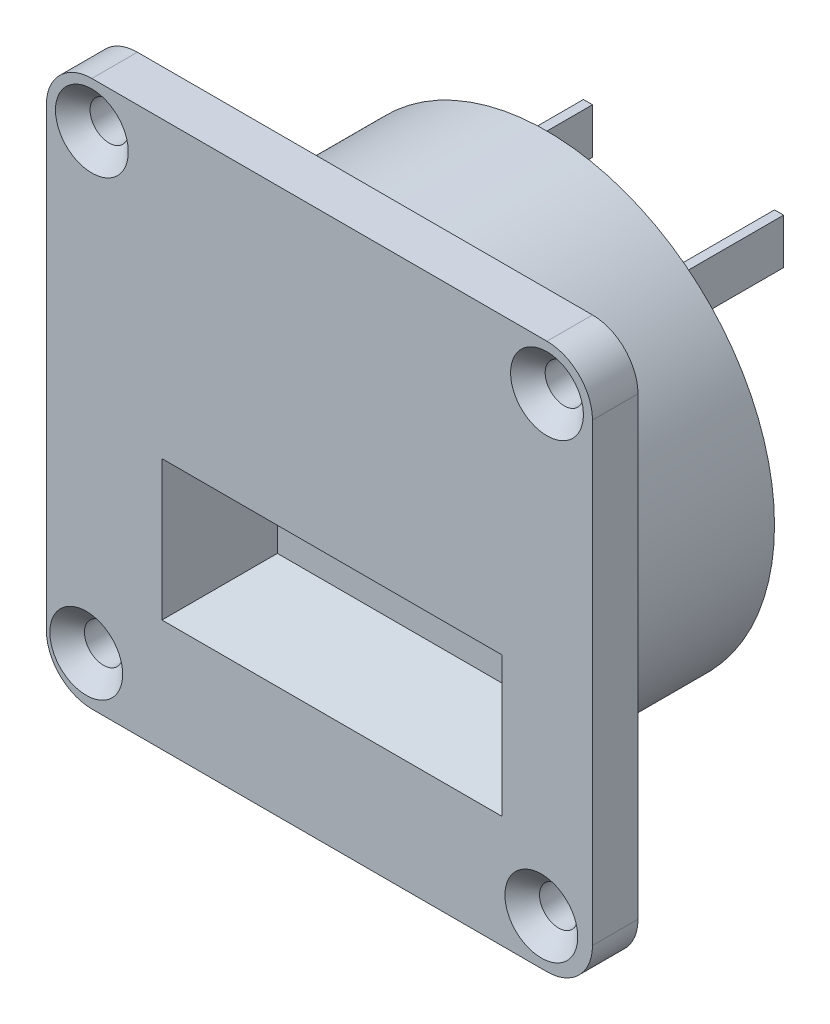
ISO-10303-21;
HEADER;
FILE_DESCRIPTION(('STEP AP214'),'2;1');
FILE_NAME('part.step','',(''),(''),'','','');
FILE_SCHEMA(('AUTOMOTIVE_DESIGN { 1 0 10303 214 1 1 1 1 }'));
ENDSEC;
DATA;
#1=APPLICATION_CONTEXT('core data for automotive mechanical design processes');
#2=APPLICATION_PROTOCOL_DEFINITION('international standard','automotive_design',2000,#1);
#3=PRODUCT_CONTEXT('',#1,'mechanical');
#4=PRODUCT('Part','Part','',(#3));
#5=PRODUCT_RELATED_PRODUCT_CATEGORY('part','',(#4));
#6=PRODUCT_DEFINITION_FORMATION('','',#4);
#7=PRODUCT_DEFINITION_CONTEXT('part definition',#1,'design');
#8=PRODUCT_DEFINITION('design','',#6,#7);
#9=PRODUCT_DEFINITION_SHAPE('','',#8);
#10=(LENGTH_UNIT() NAMED_UNIT(*) SI_UNIT(.MILLI.,.METRE.));
#11=(NAMED_UNIT(*) PLANE_ANGLE_UNIT() SI_UNIT($,.RADIAN.));
#12=(NAMED_UNIT(*) SI_UNIT($,.STERADIAN.) SOLID_ANGLE_UNIT());
#13=UNCERTAINTY_MEASURE_WITH_UNIT(LENGTH_MEASURE(1.E-05),#10,'distance_accuracy_value','');
#14=(GEOMETRIC_REPRESENTATION_CONTEXT(3) GLOBAL_UNCERTAINTY_ASSIGNED_CONTEXT((#13)) GLOBAL_UNIT_ASSIGNED_CONTEXT((#10,
#11,#12)) REPRESENTATION_CONTEXT('',''));
#15=CARTESIAN_POINT('',(0.,0.,0.));
#16=DIRECTION('',(0.,0.,1.));
#17=DIRECTION('',(1.,0.,0.));
#18=AXIS2_PLACEMENT_3D('',#15,#16,#17);
#19=CARTESIAN_POINT('',(0.,60.,5.));
#20=DIRECTION('',(0.,0.,-1.));
#21=DIRECTION('',(-1.,0.,0.));
#22=AXIS2_PLACEMENT_3D('',#19,#20,#21);
#23=PLANE('',#22);
#24=CARTESIAN_POINT('',(54.382493283612,5.,5.));
#25=DIRECTION('',(0.,0.,-1.));
#26=DIRECTION('',(-1.,0.,0.));
#27=AXIS2_PLACEMENT_3D('',#24,#25,#26);
#28=CIRCLE('',#27,4.);
#29=CARTESIAN_POINT('',(50.382493283612,5.,5.));
#30=VERTEX_POINT('',#29);
#31=EDGE_CURVE('E340',#30,#30,#28,.T.);
#32=ORIENTED_EDGE('',*,*,#31,.T.);
#33=EDGE_LOOP('',(#32));
#34=FACE_BOUND('',#33,.T.);
#35=CARTESIAN_POINT('',(4.38249328361201,5.,5.));
#36=DIRECTION('',(0.,0.,-1.));
#37=DIRECTION('',(-1.,0.,0.));
#38=AXIS2_PLACEMENT_3D('',#35,#36,#37);
#39=CIRCLE('',#38,4.);
#40=CARTESIAN_POINT('',(0.382493283612007,5.,5.));
#41=VERTEX_POINT('',#40);
#42=EDGE_CURVE('E337',#41,#41,#39,.T.);
#43=ORIENTED_EDGE('',*,*,#42,.T.);
#44=EDGE_LOOP('',(#43));
#45=FACE_BOUND('',#44,.T.);
#46=CARTESIAN_POINT('',(5.,55.,5.));
#47=DIRECTION('',(0.,0.,-1.));
#48=DIRECTION('',(-1.,0.,0.));
#49=AXIS2_PLACEMENT_3D('',#46,#47,#48);
#50=CIRCLE('',#49,4.);
#51=CARTESIAN_POINT('',(1.,55.,5.));
#52=VERTEX_POINT('',#51);
#53=EDGE_CURVE('E334',#52,#52,#50,.T.);
#54=ORIENTED_EDGE('',*,*,#53,.T.);
#55=EDGE_LOOP('',(#54));
#56=FACE_BOUND('',#55,.T.);
#57=CARTESIAN_POINT('',(55.,55.,5.));
#58=DIRECTION('',(0.,0.,-1.));
#59=DIRECTION('',(-1.,0.,0.));
#60=AXIS2_PLACEMENT_3D('',#57,#58,#59);
#61=CIRCLE('',#60,4.);
#62=CARTESIAN_POINT('',(51.,55.,5.));
#63=VERTEX_POINT('',#62);
#64=EDGE_CURVE('E331',#63,#63,#61,.T.);
#65=ORIENTED_EDGE('',*,*,#64,.T.);
#66=EDGE_LOOP('',(#65));
#67=FACE_BOUND('',#66,.T.);
#68=DIRECTION('',(-1.,0.,0.));
#69=VECTOR('',#68,1.);
#70=CARTESIAN_POINT('',(15.3784033040619,12.3205080756888,5.));
#71=LINE('',#70,#69);
#72=CARTESIAN_POINT('',(12.6989113797507,12.3205080756888,5.));
#73=VERTEX_POINT('',#72);
#74=CARTESIAN_POINT('',(50.0578952283731,12.3205080756888,5.));
#75=VERTEX_POINT('',#74);
#76=EDGE_CURVE('E295',#73,#75,#71,.F.);
#77=ORIENTED_EDGE('',*,*,#76,.F.);
#78=DIRECTION('',(0.,1.,0.));
#79=VECTOR('',#78,1.);
#80=CARTESIAN_POINT('',(12.6989113797507,15.,5.));
#81=LINE('',#80,#79);
#82=CARTESIAN_POINT('',(12.6989113797507,27.6794919243112,5.));
#83=VERTEX_POINT('',#82);
#84=EDGE_CURVE('E174',#83,#73,#81,.F.);
#85=ORIENTED_EDGE('',*,*,#84,.F.);
#86=DIRECTION('',(1.,0.,0.));
#87=VECTOR('',#86,1.);
#88=CARTESIAN_POINT('',(15.3784033040619,27.6794919243112,5.));
#89=LINE('',#88,#87);
#90=CARTESIAN_POINT('',(50.0578952283731,27.6794919243112,5.));
#91=VERTEX_POINT('',#90);
#92=EDGE_CURVE('E191',#91,#83,#89,.F.);
#93=ORIENTED_EDGE('',*,*,#92,.F.);
#94=DIRECTION('',(0.,-1.,0.));
#95=VECTOR('',#94,1.);
#96=CARTESIAN_POINT('',(50.0578952283731,15.,5.));
#97=LINE('',#96,#95);
#98=EDGE_CURVE('E194',#75,#91,#97,.F.);
#99=ORIENTED_EDGE('',*,*,#98,.F.);
#100=EDGE_LOOP('',(#77,#85,#93,#99));
#101=FACE_BOUND('',#100,.T.);
#102=DIRECTION('',(0.,-1.,0.));
#103=VECTOR('',#102,1.);
#104=CARTESIAN_POINT('',(0.,0.,5.));
#105=LINE('',#104,#103);
#106=CARTESIAN_POINT('',(0.,55.,5.));
#107=VERTEX_POINT('',#106);
#108=CARTESIAN_POINT('',(0.,5.,5.));
#109=VERTEX_POINT('',#108);
#110=EDGE_CURVE('E278',#107,#109,#105,.T.);
#111=ORIENTED_EDGE('',*,*,#110,.T.);
#112=CARTESIAN_POINT('',(5.,5.,5.));
#113=DIRECTION('',(0.,0.,-1.));
#114=DIRECTION('',(-1.,0.,0.));
#115=AXIS2_PLACEMENT_3D('',#112,#113,#114);
#116=CIRCLE('',#115,5.);
#117=CARTESIAN_POINT('',(5.,0.,5.));
#118=VERTEX_POINT('',#117);
#119=EDGE_CURVE('E320',#109,#118,#116,.F.);
#120=ORIENTED_EDGE('',*,*,#119,.T.);
#121=DIRECTION('',(1.,0.,0.));
#122=VECTOR('',#121,1.);
#123=CARTESIAN_POINT('',(0.,0.,5.));
#124=LINE('',#123,#122);
#125=CARTESIAN_POINT('',(55.,0.,5.));
#126=VERTEX_POINT('',#125);
#127=EDGE_CURVE('E281',#118,#126,#124,.T.);
#128=ORIENTED_EDGE('',*,*,#127,.T.);
#129=CARTESIAN_POINT('',(55.,5.,5.));
#130=DIRECTION('',(0.,0.,-1.));
#131=DIRECTION('',(-1.,0.,0.));
#132=AXIS2_PLACEMENT_3D('',#129,#130,#131);
#133=CIRCLE('',#132,5.);
#134=CARTESIAN_POINT('',(60.,5.,5.));
#135=VERTEX_POINT('',#134);
#136=EDGE_CURVE('E318',#126,#135,#133,.F.);
#137=ORIENTED_EDGE('',*,*,#136,.T.);
#138=DIRECTION('',(0.,1.,0.));
#139=VECTOR('',#138,1.);
#140=CARTESIAN_POINT('',(60.,0.,5.));
#141=LINE('',#140,#139);
#142=CARTESIAN_POINT('',(60.,55.,5.));
#143=VERTEX_POINT('',#142);
#144=EDGE_CURVE('E284',#135,#143,#141,.T.);
#145=ORIENTED_EDGE('',*,*,#144,.T.);
#146=CARTESIAN_POINT('',(55.,55.,5.));
#147=DIRECTION('',(0.,0.,-1.));
#148=DIRECTION('',(-1.,0.,0.));
#149=AXIS2_PLACEMENT_3D('',#146,#147,#148);
#150=CIRCLE('',#149,5.);
#151=CARTESIAN_POINT('',(55.,60.,5.));
#152=VERTEX_POINT('',#151);
#153=EDGE_CURVE('E51',#143,#152,#150,.F.);
#154=ORIENTED_EDGE('',*,*,#153,.T.);
#155=DIRECTION('',(-1.,0.,0.));
#156=VECTOR('',#155,1.);
#157=CARTESIAN_POINT('',(0.,60.,5.));
#158=LINE('',#157,#156);
#159=CARTESIAN_POINT('',(5.,60.,5.));
#160=VERTEX_POINT('',#159);
#161=EDGE_CURVE('E286',#152,#160,#158,.T.);
#162=ORIENTED_EDGE('',*,*,#161,.T.);
#163=CARTESIAN_POINT('',(5.,55.,5.));
#164=DIRECTION('',(0.,0.,-1.));
#165=DIRECTION('',(-1.,0.,0.));
#166=AXIS2_PLACEMENT_3D('',#163,#164,#165);
#167=CIRCLE('',#166,5.);
#168=EDGE_CURVE('E316',#160,#107,#167,.F.);
#169=ORIENTED_EDGE('',*,*,#168,.T.);
#170=EDGE_LOOP('',(#111,#120,#128,#137,#145,#154,#162,#169));
#171=FACE_BOUND('',#170,.T.);
#172=ADVANCED_FACE('F29',(#34,#45,#56,#67,#101,#171),#23,.F.);
#173=CARTESIAN_POINT('',(30.,30.,-20.));
#174=DIRECTION('',(0.,0.,-1.));
#175=DIRECTION('',(-1.,0.,0.));
#176=AXIS2_PLACEMENT_3D('',#173,#174,#175);
#177=PLANE('',#176);
#178=DIRECTION('',(-1.,0.,0.));
#179=VECTOR('',#178,1.);
#180=CARTESIAN_POINT('',(41.,40.,-20.));
#181=LINE('',#180,#179);
#182=CARTESIAN_POINT('',(41.,40.,-20.));
#183=VERTEX_POINT('',#182);
#184=CARTESIAN_POINT('',(40.,40.,-20.));
#185=VERTEX_POINT('',#184);
#186=EDGE_CURVE('E235',#183,#185,#181,.T.);
#187=ORIENTED_EDGE('',*,*,#186,.F.);
#188=DIRECTION('',(0.,-1.,0.));
#189=VECTOR('',#188,1.);
#190=CARTESIAN_POINT('',(41.,40.,-20.));
#191=LINE('',#190,#189);
#192=CARTESIAN_POINT('',(41.,45.,-20.));
#193=VERTEX_POINT('',#192);
#194=EDGE_CURVE('E232',#193,#183,#191,.T.);
#195=ORIENTED_EDGE('',*,*,#194,.F.);
#196=DIRECTION('',(1.,0.,0.));
#197=VECTOR('',#196,1.);
#198=CARTESIAN_POINT('',(41.,45.,-20.));
#199=LINE('',#198,#197);
#200=CARTESIAN_POINT('',(40.,45.,-20.));
#201=VERTEX_POINT('',#200);
#202=EDGE_CURVE('E240',#201,#193,#199,.T.);
#203=ORIENTED_EDGE('',*,*,#202,.F.);
#204=DIRECTION('',(0.,1.,0.));
#205=VECTOR('',#204,1.);
#206=CARTESIAN_POINT('',(40.,40.,-20.));
#207=LINE('',#206,#205);
#208=EDGE_CURVE('E237',#185,#201,#207,.T.);
#209=ORIENTED_EDGE('',*,*,#208,.F.);
#210=EDGE_LOOP('',(#187,#195,#203,#209));
#211=FACE_BOUND('',#210,.T.);
#212=CARTESIAN_POINT('',(30.,30.,-20.));
#213=DIRECTION('',(0.,0.,-1.));
#214=DIRECTION('',(-1.,0.,0.));
#215=AXIS2_PLACEMENT_3D('',#212,#213,#214);
#216=CIRCLE('',#215,25.);
#217=CARTESIAN_POINT('',(5.,30.,-20.));
#218=VERTEX_POINT('',#217);
#219=EDGE_CURVE('E264',#218,#218,#216,.T.);
#220=ORIENTED_EDGE('',*,*,#219,.T.);
#221=EDGE_LOOP('',(#220));
#222=FACE_BOUND('',#221,.T.);
#223=DIRECTION('',(-1.,0.,0.));
#224=VECTOR('',#223,1.);
#225=CARTESIAN_POINT('',(20.,40.,-20.));
#226=LINE('',#225,#224);
#227=CARTESIAN_POINT('',(20.,40.,-20.));
#228=VERTEX_POINT('',#227);
#229=CARTESIAN_POINT('',(19.,40.,-20.));
#230=VERTEX_POINT('',#229);
#231=EDGE_CURVE('E205',#228,#230,#226,.T.);
#232=ORIENTED_EDGE('',*,*,#231,.F.);
#233=DIRECTION('',(0.,-1.,0.));
#234=VECTOR('',#233,1.);
#235=CARTESIAN_POINT('',(20.,45.,-20.));
#236=LINE('',#235,#234);
#237=CARTESIAN_POINT('',(20.,45.,-20.));
#238=VERTEX_POINT('',#237);
#239=EDGE_CURVE('E202',#238,#228,#236,.T.);
#240=ORIENTED_EDGE('',*,*,#239,.F.);
#241=DIRECTION('',(1.,0.,0.));
#242=VECTOR('',#241,1.);
#243=CARTESIAN_POINT('',(20.,45.,-20.));
#244=LINE('',#243,#242);
#245=CARTESIAN_POINT('',(19.,45.,-20.));
#246=VERTEX_POINT('',#245);
#247=EDGE_CURVE('E211',#246,#238,#244,.T.);
#248=ORIENTED_EDGE('',*,*,#247,.F.);
#249=DIRECTION('',(0.,1.,0.));
#250=VECTOR('',#249,1.);
#251=CARTESIAN_POINT('',(19.,45.,-20.));
#252=LINE('',#251,#250);
#253=EDGE_CURVE('E208',#230,#246,#252,.T.);
#254=ORIENTED_EDGE('',*,*,#253,.F.);
#255=EDGE_LOOP('',(#232,#240,#248,#254));
#256=FACE_BOUND('',#255,.T.);
#257=ADVANCED_FACE('F364',(#211,#222,#256),#177,.T.);
#258=CARTESIAN_POINT('',(0.,60.,0.));
#259=DIRECTION('',(0.,0.,-1.));
#260=DIRECTION('',(-1.,0.,0.));
#261=AXIS2_PLACEMENT_3D('',#258,#259,#260);
#262=PLANE('',#261);
#263=CARTESIAN_POINT('',(4.38249328361201,5.,0.));
#264=DIRECTION('',(0.,0.,1.));
#265=DIRECTION('',(1.,0.,0.));
#266=AXIS2_PLACEMENT_3D('',#263,#264,#265);
#267=CIRCLE('',#266,2.1);
#268=CARTESIAN_POINT('',(6.48249328361201,5.,0.));
#269=VERTEX_POINT('',#268);
#270=EDGE_CURVE('E696',#269,#269,#267,.T.);
#271=ORIENTED_EDGE('',*,*,#270,.T.);
#272=EDGE_LOOP('',(#271));
#273=FACE_BOUND('',#272,.T.);
#274=CARTESIAN_POINT('',(54.382493283612,5.,0.));
#275=DIRECTION('',(0.,0.,1.));
#276=DIRECTION('',(1.,0.,0.));
#277=AXIS2_PLACEMENT_3D('',#274,#275,#276);
#278=CIRCLE('',#277,2.1);
#279=CARTESIAN_POINT('',(56.482493283612,5.,0.));
#280=VERTEX_POINT('',#279);
#281=EDGE_CURVE('E693',#280,#280,#278,.T.);
#282=ORIENTED_EDGE('',*,*,#281,.T.);
#283=EDGE_LOOP('',(#282));
#284=FACE_BOUND('',#283,.T.);
#285=CARTESIAN_POINT('',(55.,55.,0.));
#286=DIRECTION('',(0.,0.,1.));
#287=DIRECTION('',(1.,0.,0.));
#288=AXIS2_PLACEMENT_3D('',#285,#286,#287);
#289=CIRCLE('',#288,2.1);
#290=CARTESIAN_POINT('',(57.1,55.,0.));
#291=VERTEX_POINT('',#290);
#292=EDGE_CURVE('E691',#291,#291,#289,.T.);
#293=ORIENTED_EDGE('',*,*,#292,.T.);
#294=EDGE_LOOP('',(#293));
#295=FACE_BOUND('',#294,.T.);
#296=CARTESIAN_POINT('',(5.,55.,0.));
#297=DIRECTION('',(0.,0.,1.));
#298=DIRECTION('',(1.,0.,0.));
#299=AXIS2_PLACEMENT_3D('',#296,#297,#298);
#300=CIRCLE('',#299,2.1);
#301=CARTESIAN_POINT('',(7.09999999999999,55.,0.));
#302=VERTEX_POINT('',#301);
#303=EDGE_CURVE('E197',#302,#302,#300,.T.);
#304=ORIENTED_EDGE('',*,*,#303,.T.);
#305=EDGE_LOOP('',(#304));
#306=FACE_BOUND('',#305,.T.);
#307=DIRECTION('',(1.,0.,0.));
#308=VECTOR('',#307,1.);
#309=CARTESIAN_POINT('',(0.,0.,0.));
#310=LINE('',#309,#308);
#311=CARTESIAN_POINT('',(5.,0.,0.));
#312=VERTEX_POINT('',#311);
#313=CARTESIAN_POINT('',(55.,0.,0.));
#314=VERTEX_POINT('',#313);
#315=EDGE_CURVE('E270',#312,#314,#310,.T.);
#316=ORIENTED_EDGE('',*,*,#315,.F.);
#317=CARTESIAN_POINT('',(5.,5.,0.));
#318=DIRECTION('',(0.,0.,-1.));
#319=DIRECTION('',(-1.,0.,0.));
#320=AXIS2_PLACEMENT_3D('',#317,#318,#319);
#321=CIRCLE('',#320,5.);
#322=CARTESIAN_POINT('',(0.,5.,0.));
#323=VERTEX_POINT('',#322);
#324=EDGE_CURVE('E308',#312,#323,#321,.T.);
#325=ORIENTED_EDGE('',*,*,#324,.T.);
#326=DIRECTION('',(0.,-1.,0.));
#327=VECTOR('',#326,1.);
#328=CARTESIAN_POINT('',(0.,0.,0.));
#329=LINE('',#328,#327);
#330=CARTESIAN_POINT('',(0.,55.,0.));
#331=VERTEX_POINT('',#330);
#332=EDGE_CURVE('E267',#331,#323,#329,.T.);
#333=ORIENTED_EDGE('',*,*,#332,.F.);
#334=CARTESIAN_POINT('',(5.,55.,0.));
#335=DIRECTION('',(0.,0.,-1.));
#336=DIRECTION('',(-1.,0.,0.));
#337=AXIS2_PLACEMENT_3D('',#334,#335,#336);
#338=CIRCLE('',#337,5.);
#339=CARTESIAN_POINT('',(5.,60.,0.));
#340=VERTEX_POINT('',#339);
#341=EDGE_CURVE('E304',#331,#340,#338,.T.);
#342=ORIENTED_EDGE('',*,*,#341,.T.);
#343=DIRECTION('',(-1.,0.,0.));
#344=VECTOR('',#343,1.);
#345=CARTESIAN_POINT('',(0.,60.,0.));
#346=LINE('',#345,#344);
#347=CARTESIAN_POINT('',(55.,60.,0.));
#348=VERTEX_POINT('',#347);
#349=EDGE_CURVE('E276',#348,#340,#346,.T.);
#350=ORIENTED_EDGE('',*,*,#349,.F.);
#351=CARTESIAN_POINT('',(55.,55.,0.));
#352=DIRECTION('',(0.,0.,-1.));
#353=DIRECTION('',(-1.,0.,0.));
#354=AXIS2_PLACEMENT_3D('',#351,#352,#353);
#355=CIRCLE('',#354,5.);
#356=CARTESIAN_POINT('',(60.,55.,0.));
#357=VERTEX_POINT('',#356);
#358=EDGE_CURVE('E302',#348,#357,#355,.T.);
#359=ORIENTED_EDGE('',*,*,#358,.T.);
#360=DIRECTION('',(0.,1.,0.));
#361=VECTOR('',#360,1.);
#362=CARTESIAN_POINT('',(60.,0.,0.));
#363=LINE('',#362,#361);
#364=CARTESIAN_POINT('',(60.,5.,0.));
#365=VERTEX_POINT('',#364);
#366=EDGE_CURVE('E273',#365,#357,#363,.T.);
#367=ORIENTED_EDGE('',*,*,#366,.F.);
#368=CARTESIAN_POINT('',(55.,5.,0.));
#369=DIRECTION('',(0.,0.,-1.));
#370=DIRECTION('',(-1.,0.,0.));
#371=AXIS2_PLACEMENT_3D('',#368,#369,#370);
#372=CIRCLE('',#371,5.);
#373=EDGE_CURVE('E306',#365,#314,#372,.T.);
#374=ORIENTED_EDGE('',*,*,#373,.T.);
#375=EDGE_LOOP('',(#316,#325,#333,#342,#350,#359,#367,#374));
#376=FACE_BOUND('',#375,.T.);
#377=CARTESIAN_POINT('',(30.,30.,0.));
#378=DIRECTION('',(0.,0.,-1.));
#379=DIRECTION('',(-1.,0.,0.));
#380=AXIS2_PLACEMENT_3D('',#377,#378,#379);
#381=CIRCLE('',#380,25.);
#382=CARTESIAN_POINT('',(5.,30.,0.));
#383=VERTEX_POINT('',#382);
#384=EDGE_CURVE('E261',#383,#383,#381,.T.);
#385=ORIENTED_EDGE('',*,*,#384,.F.);
#386=EDGE_LOOP('',(#385));
#387=FACE_BOUND('',#386,.T.);
#388=ADVANCED_FACE('F385',(#273,#284,#295,#306,#376,#387),#262,.T.);
#389=CARTESIAN_POINT('',(0.,0.,5.));
#390=DIRECTION('',(1.,0.,0.));
#391=DIRECTION('',(0.,0.,-1.));
#392=AXIS2_PLACEMENT_3D('',#389,#390,#391);
#393=PLANE('',#392);
#394=ORIENTED_EDGE('',*,*,#332,.T.);
#395=DIRECTION('',(0.,0.,-1.));
#396=VECTOR('',#395,1.);
#397=CARTESIAN_POINT('',(0.,5.,5.));
#398=LINE('',#397,#396);
#399=EDGE_CURVE('E313',#323,#109,#398,.F.);
#400=ORIENTED_EDGE('',*,*,#399,.T.);
#401=ORIENTED_EDGE('',*,*,#110,.F.);
#402=DIRECTION('',(0.,0.,-1.));
#403=VECTOR('',#402,1.);
#404=CARTESIAN_POINT('',(0.,55.,5.));
#405=LINE('',#404,#403);
#406=EDGE_CURVE('E310',#107,#331,#405,.T.);
#407=ORIENTED_EDGE('',*,*,#406,.T.);
#408=EDGE_LOOP('',(#394,#400,#401,#407));
#409=FACE_BOUND('',#408,.T.);
#410=ADVANCED_FACE('F404',(#409),#393,.F.);
#411=CARTESIAN_POINT('',(0.,0.,5.));
#412=DIRECTION('',(0.,1.,0.));
#413=DIRECTION('',(0.,0.,1.));
#414=AXIS2_PLACEMENT_3D('',#411,#412,#413);
#415=PLANE('',#414);
#416=ORIENTED_EDGE('',*,*,#127,.F.);
#417=DIRECTION('',(0.,0.,-1.));
#418=VECTOR('',#417,1.);
#419=CARTESIAN_POINT('',(5.,0.,5.));
#420=LINE('',#419,#418);
#421=EDGE_CURVE('E299',#118,#312,#420,.T.);
#422=ORIENTED_EDGE('',*,*,#421,.T.);
#423=ORIENTED_EDGE('',*,*,#315,.T.);
#424=DIRECTION('',(0.,0.,-1.));
#425=VECTOR('',#424,1.);
#426=CARTESIAN_POINT('',(55.,0.,5.));
#427=LINE('',#426,#425);
#428=EDGE_CURVE('E288',#314,#126,#427,.F.);
#429=ORIENTED_EDGE('',*,*,#428,.T.);
#430=EDGE_LOOP('',(#416,#422,#423,#429));
#431=FACE_BOUND('',#430,.T.);
#432=ADVANCED_FACE('F382',(#431),#415,.F.);
#433=CARTESIAN_POINT('',(60.,0.,5.));
#434=DIRECTION('',(-1.,0.,0.));
#435=DIRECTION('',(0.,0.,1.));
#436=AXIS2_PLACEMENT_3D('',#433,#434,#435);
#437=PLANE('',#436);
#438=ORIENTED_EDGE('',*,*,#144,.F.);
#439=DIRECTION('',(0.,0.,-1.));
#440=VECTOR('',#439,1.);
#441=CARTESIAN_POINT('',(60.,5.,5.));
#442=LINE('',#441,#440);
#443=EDGE_CURVE('E324',#135,#365,#442,.T.);
#444=ORIENTED_EDGE('',*,*,#443,.T.);
#445=ORIENTED_EDGE('',*,*,#366,.T.);
#446=DIRECTION('',(0.,0.,-1.));
#447=VECTOR('',#446,1.);
#448=CARTESIAN_POINT('',(60.,55.,5.));
#449=LINE('',#448,#447);
#450=EDGE_CURVE('E322',#357,#143,#449,.F.);
#451=ORIENTED_EDGE('',*,*,#450,.T.);
#452=EDGE_LOOP('',(#438,#444,#445,#451));
#453=FACE_BOUND('',#452,.T.);
#454=ADVANCED_FACE('F395',(#453),#437,.F.);
#455=CARTESIAN_POINT('',(0.,60.,5.));
#456=DIRECTION('',(0.,-1.,0.));
#457=DIRECTION('',(0.,0.,-1.));
#458=AXIS2_PLACEMENT_3D('',#455,#456,#457);
#459=PLANE('',#458);
#460=ORIENTED_EDGE('',*,*,#349,.T.);
#461=DIRECTION('',(0.,0.,-1.));
#462=VECTOR('',#461,1.);
#463=CARTESIAN_POINT('',(5.,60.,5.));
#464=LINE('',#463,#462);
#465=EDGE_CURVE('E44',#340,#160,#464,.F.);
#466=ORIENTED_EDGE('',*,*,#465,.T.);
#467=ORIENTED_EDGE('',*,*,#161,.F.);
#468=DIRECTION('',(0.,0.,-1.));
#469=VECTOR('',#468,1.);
#470=CARTESIAN_POINT('',(55.,60.,5.));
#471=LINE('',#470,#469);
#472=EDGE_CURVE('E327',#152,#348,#471,.T.);
#473=ORIENTED_EDGE('',*,*,#472,.T.);
#474=EDGE_LOOP('',(#460,#466,#467,#473));
#475=FACE_BOUND('',#474,.T.);
#476=ADVANCED_FACE('F401',(#475),#459,.F.);
#477=CARTESIAN_POINT('',(30.,30.,-20.));
#478=DIRECTION('',(0.,0.,1.));
#479=DIRECTION('',(1.,0.,0.));
#480=AXIS2_PLACEMENT_3D('',#477,#478,#479);
#481=CYLINDRICAL_SURFACE('',#480,25.);
#482=ORIENTED_EDGE('',*,*,#219,.F.);
#483=EDGE_LOOP('',(#482));
#484=FACE_BOUND('',#483,.T.);
#485=ORIENTED_EDGE('',*,*,#384,.T.);
#486=EDGE_LOOP('',(#485));
#487=FACE_BOUND('',#486,.T.);
#488=ADVANCED_FACE('F474',(#484,#487),#481,.T.);
#489=CARTESIAN_POINT('',(41.,40.,-35.));
#490=DIRECTION('',(-1.,0.,0.));
#491=DIRECTION('',(0.,0.,1.));
#492=AXIS2_PLACEMENT_3D('',#489,#490,#491);
#493=PLANE('',#492);
#494=ORIENTED_EDGE('',*,*,#194,.T.);
#495=DIRECTION('',(0.,0.,1.));
#496=VECTOR('',#495,1.);
#497=CARTESIAN_POINT('',(41.,40.,-35.));
#498=LINE('',#497,#496);
#499=CARTESIAN_POINT('',(41.,40.,-35.));
#500=VERTEX_POINT('',#499);
#501=EDGE_CURVE('E259',#500,#183,#498,.T.);
#502=ORIENTED_EDGE('',*,*,#501,.F.);
#503=DIRECTION('',(0.,-1.,0.));
#504=VECTOR('',#503,1.);
#505=CARTESIAN_POINT('',(41.,40.,-35.));
#506=LINE('',#505,#504);
#507=CARTESIAN_POINT('',(41.,45.,-35.));
#508=VERTEX_POINT('',#507);
#509=EDGE_CURVE('E242',#508,#500,#506,.T.);
#510=ORIENTED_EDGE('',*,*,#509,.F.);
#511=DIRECTION('',(0.,0.,1.));
#512=VECTOR('',#511,1.);
#513=CARTESIAN_POINT('',(41.,45.,-35.));
#514=LINE('',#513,#512);
#515=EDGE_CURVE('E251',#508,#193,#514,.T.);
#516=ORIENTED_EDGE('',*,*,#515,.T.);
#517=EDGE_LOOP('',(#494,#502,#510,#516));
#518=FACE_BOUND('',#517,.T.);
#519=ADVANCED_FACE('F470',(#518),#493,.F.);
#520=CARTESIAN_POINT('',(41.,40.,-35.));
#521=DIRECTION('',(0.,1.,0.));
#522=DIRECTION('',(0.,0.,1.));
#523=AXIS2_PLACEMENT_3D('',#520,#521,#522);
#524=PLANE('',#523);
#525=ORIENTED_EDGE('',*,*,#186,.T.);
#526=DIRECTION('',(0.,0.,1.));
#527=VECTOR('',#526,1.);
#528=CARTESIAN_POINT('',(40.,40.,-35.));
#529=LINE('',#528,#527);
#530=CARTESIAN_POINT('',(40.,40.,-35.));
#531=VERTEX_POINT('',#530);
#532=EDGE_CURVE('E256',#531,#185,#529,.T.);
#533=ORIENTED_EDGE('',*,*,#532,.F.);
#534=DIRECTION('',(-1.,0.,0.));
#535=VECTOR('',#534,1.);
#536=CARTESIAN_POINT('',(41.,40.,-35.));
#537=LINE('',#536,#535);
#538=EDGE_CURVE('E245',#500,#531,#537,.T.);
#539=ORIENTED_EDGE('',*,*,#538,.F.);
#540=ORIENTED_EDGE('',*,*,#501,.T.);
#541=EDGE_LOOP('',(#525,#533,#539,#540));
#542=FACE_BOUND('',#541,.T.);
#543=ADVANCED_FACE('F466',(#542),#524,.F.);
#544=CARTESIAN_POINT('',(40.,40.,-35.));
#545=DIRECTION('',(1.,0.,0.));
#546=DIRECTION('',(0.,0.,-1.));
#547=AXIS2_PLACEMENT_3D('',#544,#545,#546);
#548=PLANE('',#547);
#549=ORIENTED_EDGE('',*,*,#208,.T.);
#550=DIRECTION('',(0.,0.,1.));
#551=VECTOR('',#550,1.);
#552=CARTESIAN_POINT('',(40.,45.,-35.));
#553=LINE('',#552,#551);
#554=CARTESIAN_POINT('',(40.,45.,-35.));
#555=VERTEX_POINT('',#554);
#556=EDGE_CURVE('E254',#555,#201,#553,.T.);
#557=ORIENTED_EDGE('',*,*,#556,.F.);
#558=DIRECTION('',(0.,1.,0.));
#559=VECTOR('',#558,1.);
#560=CARTESIAN_POINT('',(40.,40.,-35.));
#561=LINE('',#560,#559);
#562=EDGE_CURVE('E247',#531,#555,#561,.T.);
#563=ORIENTED_EDGE('',*,*,#562,.F.);
#564=ORIENTED_EDGE('',*,*,#532,.T.);
#565=EDGE_LOOP('',(#549,#557,#563,#564));
#566=FACE_BOUND('',#565,.T.);
#567=ADVANCED_FACE('F462',(#566),#548,.F.);
#568=CARTESIAN_POINT('',(41.,45.,-35.));
#569=DIRECTION('',(0.,-1.,0.));
#570=DIRECTION('',(0.,0.,-1.));
#571=AXIS2_PLACEMENT_3D('',#568,#569,#570);
#572=PLANE('',#571);
#573=ORIENTED_EDGE('',*,*,#202,.T.);
#574=ORIENTED_EDGE('',*,*,#515,.F.);
#575=DIRECTION('',(1.,0.,0.));
#576=VECTOR('',#575,1.);
#577=CARTESIAN_POINT('',(41.,45.,-35.));
#578=LINE('',#577,#576);
#579=EDGE_CURVE('E249',#555,#508,#578,.T.);
#580=ORIENTED_EDGE('',*,*,#579,.F.);
#581=ORIENTED_EDGE('',*,*,#556,.T.);
#582=EDGE_LOOP('',(#573,#574,#580,#581));
#583=FACE_BOUND('',#582,.T.);
#584=ADVANCED_FACE('F458',(#583),#572,.F.);
#585=CARTESIAN_POINT('',(41.,45.,-35.));
#586=DIRECTION('',(0.,0.,1.));
#587=DIRECTION('',(1.,0.,0.));
#588=AXIS2_PLACEMENT_3D('',#585,#586,#587);
#589=PLANE('',#588);
#590=ORIENTED_EDGE('',*,*,#509,.T.);
#591=ORIENTED_EDGE('',*,*,#538,.T.);
#592=ORIENTED_EDGE('',*,*,#562,.T.);
#593=ORIENTED_EDGE('',*,*,#579,.T.);
#594=EDGE_LOOP('',(#590,#591,#592,#593));
#595=FACE_BOUND('',#594,.T.);
#596=ADVANCED_FACE('F454',(#595),#589,.F.);
#597=CARTESIAN_POINT('',(20.,45.,-35.));
#598=DIRECTION('',(-1.,0.,0.));
#599=DIRECTION('',(0.,0.,1.));
#600=AXIS2_PLACEMENT_3D('',#597,#598,#599);
#601=PLANE('',#600);
#602=ORIENTED_EDGE('',*,*,#239,.T.);
#603=DIRECTION('',(0.,0.,1.));
#604=VECTOR('',#603,1.);
#605=CARTESIAN_POINT('',(20.,40.,-35.));
#606=LINE('',#605,#604);
#607=CARTESIAN_POINT('',(20.,40.,-35.));
#608=VERTEX_POINT('',#607);
#609=EDGE_CURVE('E230',#608,#228,#606,.T.);
#610=ORIENTED_EDGE('',*,*,#609,.F.);
#611=DIRECTION('',(0.,-1.,0.));
#612=VECTOR('',#611,1.);
#613=CARTESIAN_POINT('',(20.,45.,-35.));
#614=LINE('',#613,#612);
#615=CARTESIAN_POINT('',(20.,45.,-35.));
#616=VERTEX_POINT('',#615);
#617=EDGE_CURVE('E213',#616,#608,#614,.T.);
#618=ORIENTED_EDGE('',*,*,#617,.F.);
#619=DIRECTION('',(0.,0.,1.));
#620=VECTOR('',#619,1.);
#621=CARTESIAN_POINT('',(20.,45.,-35.));
#622=LINE('',#621,#620);
#623=EDGE_CURVE('E222',#616,#238,#622,.T.);
#624=ORIENTED_EDGE('',*,*,#623,.T.);
#625=EDGE_LOOP('',(#602,#610,#618,#624));
#626=FACE_BOUND('',#625,.T.);
#627=ADVANCED_FACE('F450',(#626),#601,.F.);
#628=CARTESIAN_POINT('',(20.,40.,-35.));
#629=DIRECTION('',(0.,1.,0.));
#630=DIRECTION('',(0.,0.,1.));
#631=AXIS2_PLACEMENT_3D('',#628,#629,#630);
#632=PLANE('',#631);
#633=ORIENTED_EDGE('',*,*,#231,.T.);
#634=DIRECTION('',(0.,0.,1.));
#635=VECTOR('',#634,1.);
#636=CARTESIAN_POINT('',(19.,40.,-35.));
#637=LINE('',#636,#635);
#638=CARTESIAN_POINT('',(19.,40.,-35.));
#639=VERTEX_POINT('',#638);
#640=EDGE_CURVE('E227',#639,#230,#637,.T.);
#641=ORIENTED_EDGE('',*,*,#640,.F.);
#642=DIRECTION('',(-1.,0.,0.));
#643=VECTOR('',#642,1.);
#644=CARTESIAN_POINT('',(20.,40.,-35.));
#645=LINE('',#644,#643);
#646=EDGE_CURVE('E216',#608,#639,#645,.T.);
#647=ORIENTED_EDGE('',*,*,#646,.F.);
#648=ORIENTED_EDGE('',*,*,#609,.T.);
#649=EDGE_LOOP('',(#633,#641,#647,#648));
#650=FACE_BOUND('',#649,.T.);
#651=ADVANCED_FACE('F446',(#650),#632,.F.);
#652=CARTESIAN_POINT('',(19.,45.,-35.));
#653=DIRECTION('',(1.,0.,0.));
#654=DIRECTION('',(0.,0.,-1.));
#655=AXIS2_PLACEMENT_3D('',#652,#653,#654);
#656=PLANE('',#655);
#657=ORIENTED_EDGE('',*,*,#253,.T.);
#658=DIRECTION('',(0.,0.,1.));
#659=VECTOR('',#658,1.);
#660=CARTESIAN_POINT('',(19.,45.,-35.));
#661=LINE('',#660,#659);
#662=CARTESIAN_POINT('',(19.,45.,-35.));
#663=VERTEX_POINT('',#662);
#664=EDGE_CURVE('E225',#663,#246,#661,.T.);
#665=ORIENTED_EDGE('',*,*,#664,.F.);
#666=DIRECTION('',(0.,1.,0.));
#667=VECTOR('',#666,1.);
#668=CARTESIAN_POINT('',(19.,45.,-35.));
#669=LINE('',#668,#667);
#670=EDGE_CURVE('E218',#639,#663,#669,.T.);
#671=ORIENTED_EDGE('',*,*,#670,.F.);
#672=ORIENTED_EDGE('',*,*,#640,.T.);
#673=EDGE_LOOP('',(#657,#665,#671,#672));
#674=FACE_BOUND('',#673,.T.);
#675=ADVANCED_FACE('F442',(#674),#656,.F.);
#676=CARTESIAN_POINT('',(20.,45.,-35.));
#677=DIRECTION('',(0.,-1.,0.));
#678=DIRECTION('',(0.,0.,-1.));
#679=AXIS2_PLACEMENT_3D('',#676,#677,#678);
#680=PLANE('',#679);
#681=ORIENTED_EDGE('',*,*,#247,.T.);
#682=ORIENTED_EDGE('',*,*,#623,.F.);
#683=DIRECTION('',(1.,0.,0.));
#684=VECTOR('',#683,1.);
#685=CARTESIAN_POINT('',(20.,45.,-35.));
#686=LINE('',#685,#684);
#687=EDGE_CURVE('E220',#663,#616,#686,.T.);
#688=ORIENTED_EDGE('',*,*,#687,.F.);
#689=ORIENTED_EDGE('',*,*,#664,.T.);
#690=EDGE_LOOP('',(#681,#682,#688,#689));
#691=FACE_BOUND('',#690,.T.);
#692=ADVANCED_FACE('F438',(#691),#680,.F.);
#693=CARTESIAN_POINT('',(20.,40.,-35.));
#694=DIRECTION('',(0.,0.,-1.));
#695=DIRECTION('',(-1.,0.,0.));
#696=AXIS2_PLACEMENT_3D('',#693,#694,#695);
#697=PLANE('',#696);
#698=ORIENTED_EDGE('',*,*,#617,.T.);
#699=ORIENTED_EDGE('',*,*,#646,.T.);
#700=ORIENTED_EDGE('',*,*,#670,.T.);
#701=ORIENTED_EDGE('',*,*,#687,.T.);
#702=EDGE_LOOP('',(#698,#699,#700,#701));
#703=FACE_BOUND('',#702,.T.);
#704=ADVANCED_FACE('F435',(#703),#697,.T.);
#705=CARTESIAN_POINT('',(15.3784033040619,15.,-5.));
#706=DIRECTION('',(0.965925826289068,0.,0.258819045102521));
#707=DIRECTION('',(0.258819045102521,0.,-0.965925826289068));
#708=AXIS2_PLACEMENT_3D('',#705,#706,#707);
#709=PLANE('',#708);
#710=ORIENTED_EDGE('',*,*,#84,.T.);
#711=DIRECTION('',(-0.250562807085732,-0.250562807085732,0.935113126531029));
#712=VECTOR('',#711,1.);
#713=CARTESIAN_POINT('',(15.3784033040619,15.,-5.));
#714=LINE('',#713,#712);
#715=CARTESIAN_POINT('',(15.3784033040619,15.,-5.));
#716=VERTEX_POINT('',#715);
#717=EDGE_CURVE('E168',#716,#73,#714,.T.);
#718=ORIENTED_EDGE('',*,*,#717,.F.);
#719=DIRECTION('',(0.,-1.,0.));
#720=VECTOR('',#719,1.);
#721=CARTESIAN_POINT('',(15.3784033040619,15.,-5.));
#722=LINE('',#721,#720);
#723=CARTESIAN_POINT('',(15.3784033040619,25.,-5.));
#724=VERTEX_POINT('',#723);
#725=EDGE_CURVE('E171',#724,#716,#722,.T.);
#726=ORIENTED_EDGE('',*,*,#725,.F.);
#727=DIRECTION('',(-0.250562807085732,0.250562807085732,0.935113126531029));
#728=VECTOR('',#727,1.);
#729=CARTESIAN_POINT('',(15.3784033040619,25.,-5.));
#730=LINE('',#729,#728);
#731=EDGE_CURVE('E206',#724,#83,#730,.T.);
#732=ORIENTED_EDGE('',*,*,#731,.T.);
#733=EDGE_LOOP('',(#710,#718,#726,#732));
#734=FACE_BOUND('',#733,.T.);
#735=ADVANCED_FACE('F31',(#734),#709,.T.);
#736=CARTESIAN_POINT('',(15.3784033040619,25.,-5.));
#737=DIRECTION('',(0.,-0.965925826289068,0.258819045102521));
#738=DIRECTION('',(0.,-0.258819045102521,-0.965925826289068));
#739=AXIS2_PLACEMENT_3D('',#736,#737,#738);
#740=PLANE('',#739);
#741=ORIENTED_EDGE('',*,*,#92,.T.);
#742=ORIENTED_EDGE('',*,*,#731,.F.);
#743=DIRECTION('',(-1.,0.,0.));
#744=VECTOR('',#743,1.);
#745=CARTESIAN_POINT('',(15.3784033040619,25.,-5.));
#746=LINE('',#745,#744);
#747=CARTESIAN_POINT('',(47.3784033040619,25.,-5.));
#748=VERTEX_POINT('',#747);
#749=EDGE_CURVE('E179',#748,#724,#746,.T.);
#750=ORIENTED_EDGE('',*,*,#749,.F.);
#751=DIRECTION('',(0.250562807085732,0.250562807085732,0.935113126531029));
#752=VECTOR('',#751,1.);
#753=CARTESIAN_POINT('',(46.7505861011151,24.3721827970532,-7.3430456992633));
#754=LINE('',#753,#752);
#755=EDGE_CURVE('E290',#748,#91,#754,.T.);
#756=ORIENTED_EDGE('',*,*,#755,.T.);
#757=EDGE_LOOP('',(#741,#742,#750,#756));
#758=FACE_BOUND('',#757,.T.);
#759=ADVANCED_FACE('F416',(#758),#740,.T.);
#760=CARTESIAN_POINT('',(47.3784033040619,15.,-5.));
#761=DIRECTION('',(-0.965925826289068,0.,0.258819045102521));
#762=DIRECTION('',(0.258819045102521,0.,0.965925826289068));
#763=AXIS2_PLACEMENT_3D('',#760,#761,#762);
#764=PLANE('',#763);
#765=ORIENTED_EDGE('',*,*,#98,.T.);
#766=ORIENTED_EDGE('',*,*,#755,.F.);
#767=DIRECTION('',(0.,1.,0.));
#768=VECTOR('',#767,1.);
#769=CARTESIAN_POINT('',(47.3784033040619,15.,-5.));
#770=LINE('',#769,#768);
#771=CARTESIAN_POINT('',(47.3784033040619,15.,-5.));
#772=VERTEX_POINT('',#771);
#773=EDGE_CURVE('E187',#772,#748,#770,.T.);
#774=ORIENTED_EDGE('',*,*,#773,.F.);
#775=DIRECTION('',(0.250562807085732,-0.250562807085732,0.935113126531029));
#776=VECTOR('',#775,1.);
#777=CARTESIAN_POINT('',(45.3693882546321,17.0090150494298,-12.4977462376426));
#778=LINE('',#777,#776);
#779=EDGE_CURVE('E178',#772,#75,#778,.T.);
#780=ORIENTED_EDGE('',*,*,#779,.T.);
#781=EDGE_LOOP('',(#765,#766,#774,#780));
#782=FACE_BOUND('',#781,.T.);
#783=ADVANCED_FACE('F419',(#782),#764,.T.);
#784=CARTESIAN_POINT('',(15.3784033040619,15.,-5.));
#785=DIRECTION('',(0.,0.965925826289068,0.258819045102521));
#786=DIRECTION('',(0.,-0.258819045102521,0.965925826289068));
#787=AXIS2_PLACEMENT_3D('',#784,#785,#786);
#788=PLANE('',#787);
#789=ORIENTED_EDGE('',*,*,#76,.T.);
#790=ORIENTED_EDGE('',*,*,#779,.F.);
#791=DIRECTION('',(1.,0.,0.));
#792=VECTOR('',#791,1.);
#793=CARTESIAN_POINT('',(15.3784033040619,15.,-5.));
#794=LINE('',#793,#792);
#795=EDGE_CURVE('E182',#716,#772,#794,.T.);
#796=ORIENTED_EDGE('',*,*,#795,.F.);
#797=ORIENTED_EDGE('',*,*,#717,.T.);
#798=EDGE_LOOP('',(#789,#790,#796,#797));
#799=FACE_BOUND('',#798,.T.);
#800=ADVANCED_FACE('F183',(#799),#788,.T.);
#801=CARTESIAN_POINT('',(15.3784033040619,25.,-5.));
#802=DIRECTION('',(0.,0.,-1.));
#803=DIRECTION('',(-1.,0.,0.));
#804=AXIS2_PLACEMENT_3D('',#801,#802,#803);
#805=PLANE('',#804);
#806=ORIENTED_EDGE('',*,*,#725,.T.);
#807=ORIENTED_EDGE('',*,*,#795,.T.);
#808=ORIENTED_EDGE('',*,*,#773,.T.);
#809=ORIENTED_EDGE('',*,*,#749,.T.);
#810=EDGE_LOOP('',(#806,#807,#808,#809));
#811=FACE_BOUND('',#810,.T.);
#812=ADVANCED_FACE('F189',(#811),#805,.F.);
#813=CARTESIAN_POINT('',(5.,55.,0.));
#814=DIRECTION('',(0.,0.,1.));
#815=DIRECTION('',(1.,0.,0.));
#816=AXIS2_PLACEMENT_3D('',#813,#814,#815);
#817=CYLINDRICAL_SURFACE('',#816,2.1);
#818=CARTESIAN_POINT('',(5.,55.,3.09999999999999));
#819=DIRECTION('',(0.,0.,-1.));
#820=DIRECTION('',(-1.,0.,0.));
#821=AXIS2_PLACEMENT_3D('',#818,#819,#820);
#822=CIRCLE('',#821,2.1);
#823=CARTESIAN_POINT('',(2.9,55.,3.09999999999999));
#824=VERTEX_POINT('',#823);
#825=EDGE_CURVE('E37',#824,#824,#822,.F.);
#826=ORIENTED_EDGE('',*,*,#825,.T.);
#827=EDGE_LOOP('',(#826));
#828=FACE_BOUND('',#827,.T.);
#829=ORIENTED_EDGE('',*,*,#303,.F.);
#830=EDGE_LOOP('',(#829));
#831=FACE_BOUND('',#830,.T.);
#832=ADVANCED_FACE('F351',(#828,#831),#817,.F.);
#833=CARTESIAN_POINT('',(55.,55.,0.));
#834=DIRECTION('',(0.,0.,1.));
#835=DIRECTION('',(1.,0.,0.));
#836=AXIS2_PLACEMENT_3D('',#833,#834,#835);
#837=CYLINDRICAL_SURFACE('',#836,2.1);
#838=CARTESIAN_POINT('',(55.,55.,3.09999999999999));
#839=DIRECTION('',(0.,0.,-1.));
#840=DIRECTION('',(-1.,0.,0.));
#841=AXIS2_PLACEMENT_3D('',#838,#839,#840);
#842=CIRCLE('',#841,2.1);
#843=CARTESIAN_POINT('',(52.9,55.,3.09999999999999));
#844=VERTEX_POINT('',#843);
#845=EDGE_CURVE('E11',#844,#844,#842,.F.);
#846=ORIENTED_EDGE('',*,*,#845,.T.);
#847=EDGE_LOOP('',(#846));
#848=FACE_BOUND('',#847,.T.);
#849=ORIENTED_EDGE('',*,*,#292,.F.);
#850=EDGE_LOOP('',(#849));
#851=FACE_BOUND('',#850,.T.);
#852=ADVANCED_FACE('F431',(#848,#851),#837,.F.);
#853=CARTESIAN_POINT('',(54.382493283612,5.,0.));
#854=DIRECTION('',(0.,0.,1.));
#855=DIRECTION('',(1.,0.,0.));
#856=AXIS2_PLACEMENT_3D('',#853,#854,#855);
#857=CYLINDRICAL_SURFACE('',#856,2.1);
#858=CARTESIAN_POINT('',(54.382493283612,5.,3.09999999999999));
#859=DIRECTION('',(0.,0.,-1.));
#860=DIRECTION('',(-1.,0.,0.));
#861=AXIS2_PLACEMENT_3D('',#858,#859,#860);
#862=CIRCLE('',#861,2.1);
#863=CARTESIAN_POINT('',(52.282493283612,5.,3.09999999999999));
#864=VERTEX_POINT('',#863);
#865=EDGE_CURVE('E343',#864,#864,#862,.F.);
#866=ORIENTED_EDGE('',*,*,#865,.T.);
#867=EDGE_LOOP('',(#866));
#868=FACE_BOUND('',#867,.T.);
#869=ORIENTED_EDGE('',*,*,#281,.F.);
#870=EDGE_LOOP('',(#869));
#871=FACE_BOUND('',#870,.T.);
#872=ADVANCED_FACE('F603',(#868,#871),#857,.F.);
#873=CARTESIAN_POINT('',(4.38249328361201,5.,0.));
#874=DIRECTION('',(0.,0.,1.));
#875=DIRECTION('',(1.,0.,0.));
#876=AXIS2_PLACEMENT_3D('',#873,#874,#875);
#877=CYLINDRICAL_SURFACE('',#876,2.1);
#878=CARTESIAN_POINT('',(4.38249328361201,5.,3.09999999999999));
#879=DIRECTION('',(0.,0.,-1.));
#880=DIRECTION('',(-1.,0.,0.));
#881=AXIS2_PLACEMENT_3D('',#878,#879,#880);
#882=CIRCLE('',#881,2.1);
#883=CARTESIAN_POINT('',(2.28249328361201,5.,3.09999999999999));
#884=VERTEX_POINT('',#883);
#885=EDGE_CURVE('E346',#884,#884,#882,.F.);
#886=ORIENTED_EDGE('',*,*,#885,.T.);
#887=EDGE_LOOP('',(#886));
#888=FACE_BOUND('',#887,.T.);
#889=ORIENTED_EDGE('',*,*,#270,.F.);
#890=EDGE_LOOP('',(#889));
#891=FACE_BOUND('',#890,.T.);
#892=ADVANCED_FACE('F612',(#888,#891),#877,.F.);
#893=CARTESIAN_POINT('',(5.,5.,5.));
#894=DIRECTION('',(0.,0.,-1.));
#895=DIRECTION('',(-1.,0.,0.));
#896=AXIS2_PLACEMENT_3D('',#893,#894,#895);
#897=CYLINDRICAL_SURFACE('',#896,5.);
#898=ORIENTED_EDGE('',*,*,#119,.F.);
#899=ORIENTED_EDGE('',*,*,#399,.F.);
#900=ORIENTED_EDGE('',*,*,#324,.F.);
#901=ORIENTED_EDGE('',*,*,#421,.F.);
#902=EDGE_LOOP('',(#898,#899,#900,#901));
#903=FACE_BOUND('',#902,.T.);
#904=ADVANCED_FACE('F379',(#903),#897,.T.);
#905=CARTESIAN_POINT('',(55.,5.,5.));
#906=DIRECTION('',(0.,0.,-1.));
#907=DIRECTION('',(-1.,0.,0.));
#908=AXIS2_PLACEMENT_3D('',#905,#906,#907);
#909=CYLINDRICAL_SURFACE('',#908,5.);
#910=ORIENTED_EDGE('',*,*,#136,.F.);
#911=ORIENTED_EDGE('',*,*,#428,.F.);
#912=ORIENTED_EDGE('',*,*,#373,.F.);
#913=ORIENTED_EDGE('',*,*,#443,.F.);
#914=EDGE_LOOP('',(#910,#911,#912,#913));
#915=FACE_BOUND('',#914,.T.);
#916=ADVANCED_FACE('F392',(#915),#909,.T.);
#917=CARTESIAN_POINT('',(5.,55.,5.));
#918=DIRECTION('',(0.,0.,-1.));
#919=DIRECTION('',(-1.,0.,0.));
#920=AXIS2_PLACEMENT_3D('',#917,#918,#919);
#921=CYLINDRICAL_SURFACE('',#920,5.);
#922=ORIENTED_EDGE('',*,*,#168,.F.);
#923=ORIENTED_EDGE('',*,*,#465,.F.);
#924=ORIENTED_EDGE('',*,*,#341,.F.);
#925=ORIENTED_EDGE('',*,*,#406,.F.);
#926=EDGE_LOOP('',(#922,#923,#924,#925));
#927=FACE_BOUND('',#926,.T.);
#928=ADVANCED_FACE('F403',(#927),#921,.T.);
#929=CARTESIAN_POINT('',(55.,55.,5.));
#930=DIRECTION('',(0.,0.,-1.));
#931=DIRECTION('',(-1.,0.,0.));
#932=AXIS2_PLACEMENT_3D('',#929,#930,#931);
#933=CYLINDRICAL_SURFACE('',#932,5.);
#934=ORIENTED_EDGE('',*,*,#153,.F.);
#935=ORIENTED_EDGE('',*,*,#450,.F.);
#936=ORIENTED_EDGE('',*,*,#358,.F.);
#937=ORIENTED_EDGE('',*,*,#472,.F.);
#938=EDGE_LOOP('',(#934,#935,#936,#937));
#939=FACE_BOUND('',#938,.T.);
#940=ADVANCED_FACE('F399',(#939),#933,.T.);
#941=CARTESIAN_POINT('',(54.382493283612,5.,5.));
#942=DIRECTION('',(0.,0.,1.));
#943=DIRECTION('',(1.,0.,0.));
#944=AXIS2_PLACEMENT_3D('',#941,#942,#943);
#945=CONICAL_SURFACE('',#944,4.,0.785398163397446);
#946=ORIENTED_EDGE('',*,*,#865,.F.);
#947=EDGE_LOOP('',(#946));
#948=FACE_BOUND('',#947,.T.);
#949=ORIENTED_EDGE('',*,*,#31,.F.);
#950=EDGE_LOOP('',(#949));
#951=FACE_BOUND('',#950,.T.);
#952=ADVANCED_FACE('F629',(#948,#951),#945,.F.);
#953=CARTESIAN_POINT('',(4.38249328361201,5.,5.));
#954=DIRECTION('',(0.,0.,1.));
#955=DIRECTION('',(1.,0.,0.));
#956=AXIS2_PLACEMENT_3D('',#953,#954,#955);
#957=CONICAL_SURFACE('',#956,4.,0.785398163397447);
#958=ORIENTED_EDGE('',*,*,#885,.F.);
#959=EDGE_LOOP('',(#958));
#960=FACE_BOUND('',#959,.T.);
#961=ORIENTED_EDGE('',*,*,#42,.F.);
#962=EDGE_LOOP('',(#961));
#963=FACE_BOUND('',#962,.T.);
#964=ADVANCED_FACE('F358',(#960,#963),#957,.F.);
#965=CARTESIAN_POINT('',(5.,55.,5.));
#966=DIRECTION('',(0.,0.,1.));
#967=DIRECTION('',(1.,0.,0.));
#968=AXIS2_PLACEMENT_3D('',#965,#966,#967);
#969=CONICAL_SURFACE('',#968,4.,0.785398163397447);
#970=ORIENTED_EDGE('',*,*,#825,.F.);
#971=EDGE_LOOP('',(#970));
#972=FACE_BOUND('',#971,.T.);
#973=ORIENTED_EDGE('',*,*,#53,.F.);
#974=EDGE_LOOP('',(#973));
#975=FACE_BOUND('',#974,.T.);
#976=ADVANCED_FACE('F354',(#972,#975),#969,.F.);
#977=CARTESIAN_POINT('',(55.,55.,5.));
#978=DIRECTION('',(0.,0.,1.));
#979=DIRECTION('',(1.,0.,0.));
#980=AXIS2_PLACEMENT_3D('',#977,#978,#979);
#981=CONICAL_SURFACE('',#980,4.,0.785398163397446);
#982=ORIENTED_EDGE('',*,*,#845,.F.);
#983=EDGE_LOOP('',(#982));
#984=FACE_BOUND('',#983,.T.);
#985=ORIENTED_EDGE('',*,*,#64,.F.);
#986=EDGE_LOOP('',(#985));
#987=FACE_BOUND('',#986,.T.);
#988=ADVANCED_FACE('F357',(#984,#987),#981,.F.);
#989=CLOSED_SHELL('',(#172,#257,#388,#410,#432,#454,#476,#488,#519,#543,#567,#584,#596,#627,
#651,#675,#692,#704,#735,#759,#783,#800,#812,#832,#852,#872,#892,#904,#916,#928,#940,#952,#964,
#976,#988));
#990=MANIFOLD_SOLID_BREP('B2',#989);
#991=ADVANCED_BREP_SHAPE_REPRESENTATION('',(#18,#990),#14);
#992=SHAPE_DEFINITION_REPRESENTATION(#9,#991);
ENDSEC;
END-ISO-10303-21;
